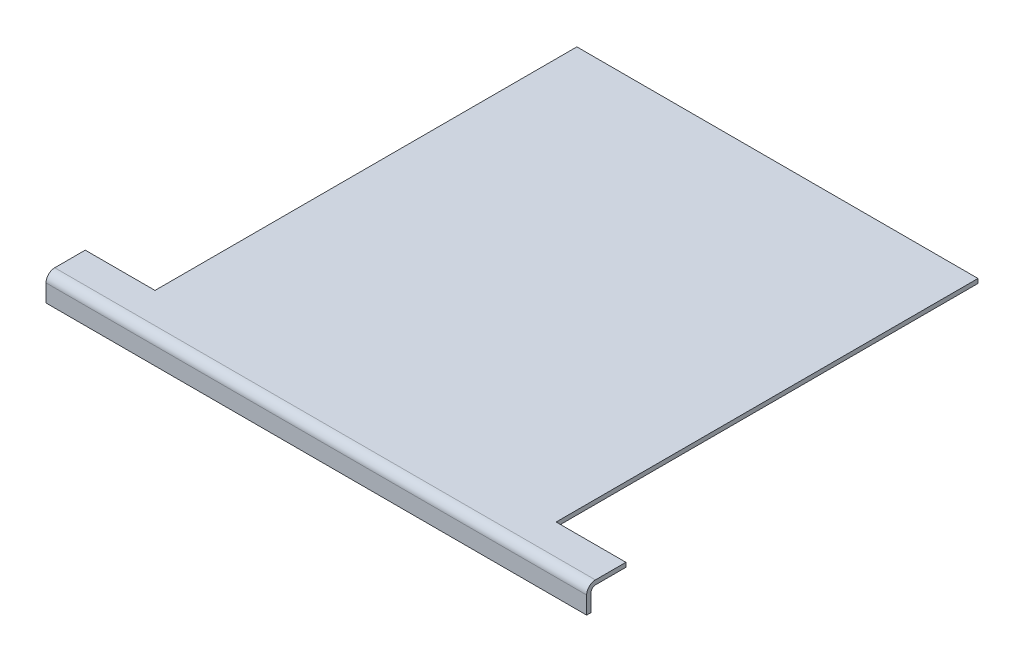
ISO-10303-21;
HEADER;
FILE_DESCRIPTION(('STEP AP214'),'2;1');
FILE_NAME('part.step','',(''),(''),'','','');
FILE_SCHEMA(('AUTOMOTIVE_DESIGN { 1 0 10303 214 1 1 1 1 }'));
ENDSEC;
DATA;
#1=APPLICATION_CONTEXT('core data for automotive mechanical design processes');
#2=APPLICATION_PROTOCOL_DEFINITION('international standard','automotive_design',2000,#1);
#3=PRODUCT_CONTEXT('',#1,'mechanical');
#4=PRODUCT('Part','Part','',(#3));
#5=PRODUCT_RELATED_PRODUCT_CATEGORY('part','',(#4));
#6=PRODUCT_DEFINITION_FORMATION('','',#4);
#7=PRODUCT_DEFINITION_CONTEXT('part definition',#1,'design');
#8=PRODUCT_DEFINITION('design','',#6,#7);
#9=PRODUCT_DEFINITION_SHAPE('','',#8);
#10=(LENGTH_UNIT() NAMED_UNIT(*) SI_UNIT(.MILLI.,.METRE.));
#11=(NAMED_UNIT(*) PLANE_ANGLE_UNIT() SI_UNIT($,.RADIAN.));
#12=(NAMED_UNIT(*) SI_UNIT($,.STERADIAN.) SOLID_ANGLE_UNIT());
#13=UNCERTAINTY_MEASURE_WITH_UNIT(LENGTH_MEASURE(1.E-05),#10,'distance_accuracy_value','');
#14=(GEOMETRIC_REPRESENTATION_CONTEXT(3) GLOBAL_UNCERTAINTY_ASSIGNED_CONTEXT((#13)) GLOBAL_UNIT_ASSIGNED_CONTEXT((#10,
#11,#12)) REPRESENTATION_CONTEXT('',''));
#15=CARTESIAN_POINT('',(0.,0.,0.));
#16=DIRECTION('',(0.,0.,1.));
#17=DIRECTION('',(1.,0.,0.));
#18=AXIS2_PLACEMENT_3D('',#15,#16,#17);
#19=CARTESIAN_POINT('',(-393.7,6.35,671.5252));
#20=DIRECTION('',(0.,0.,1.));
#21=DIRECTION('',(1.,0.,0.));
#22=AXIS2_PLACEMENT_3D('',#19,#20,#21);
#23=PLANE('',#22);
#24=DIRECTION('',(0.,1.,0.));
#25=VECTOR('',#24,1.);
#26=CARTESIAN_POINT('',(393.7,-19.05,671.5252));
#27=LINE('',#26,#25);
#28=CARTESIAN_POINT('',(393.7,-6.35,671.5252));
#29=VERTEX_POINT('',#28);
#30=CARTESIAN_POINT('',(393.7,-31.75,671.5252));
#31=VERTEX_POINT('',#30);
#32=EDGE_CURVE('E175',#29,#31,#27,.F.);
#33=ORIENTED_EDGE('',*,*,#32,.F.);
#34=DIRECTION('',(-1.,0.,0.));
#35=VECTOR('',#34,1.);
#36=CARTESIAN_POINT('',(393.7,-6.35,671.5252));
#37=LINE('',#36,#35);
#38=CARTESIAN_POINT('',(-393.7,-6.35,671.5252));
#39=VERTEX_POINT('',#38);
#40=EDGE_CURVE('E131',#39,#29,#37,.F.);
#41=ORIENTED_EDGE('',*,*,#40,.F.);
#42=DIRECTION('',(0.,1.,0.));
#43=VECTOR('',#42,1.);
#44=CARTESIAN_POINT('',(-393.7,-19.05,671.5252));
#45=LINE('',#44,#43);
#46=CARTESIAN_POINT('',(-393.7,-31.75,671.5252));
#47=VERTEX_POINT('',#46);
#48=EDGE_CURVE('E127',#47,#39,#45,.T.);
#49=ORIENTED_EDGE('',*,*,#48,.F.);
#50=DIRECTION('',(1.,0.,0.));
#51=VECTOR('',#50,1.);
#52=CARTESIAN_POINT('',(0.,-31.75,671.5252));
#53=LINE('',#52,#51);
#54=EDGE_CURVE('E194',#31,#47,#53,.F.);
#55=ORIENTED_EDGE('',*,*,#54,.F.);
#56=EDGE_LOOP('',(#33,#41,#49,#55));
#57=FACE_BOUND('',#56,.T.);
#58=ADVANCED_FACE('F33',(#57),#23,.T.);
#59=CARTESIAN_POINT('',(0.,-31.75,668.3502));
#60=DIRECTION('',(0.,-1.,0.));
#61=DIRECTION('',(0.,0.,-1.));
#62=AXIS2_PLACEMENT_3D('',#59,#60,#61);
#63=PLANE('',#62);
#64=DIRECTION('',(1.,0.,0.));
#65=VECTOR('',#64,1.);
#66=CARTESIAN_POINT('',(-393.7,-31.75,665.1752));
#67=LINE('',#66,#65);
#68=CARTESIAN_POINT('',(-393.7,-31.75,665.1752));
#69=VERTEX_POINT('',#68);
#70=CARTESIAN_POINT('',(393.7,-31.75,665.1752));
#71=VERTEX_POINT('',#70);
#72=EDGE_CURVE('E130',#69,#71,#67,.T.);
#73=ORIENTED_EDGE('',*,*,#72,.T.);
#74=DIRECTION('',(0.,0.,-1.));
#75=VECTOR('',#74,1.);
#76=CARTESIAN_POINT('',(393.7,-31.75,668.3502));
#77=LINE('',#76,#75);
#78=EDGE_CURVE('E177',#31,#71,#77,.T.);
#79=ORIENTED_EDGE('',*,*,#78,.F.);
#80=ORIENTED_EDGE('',*,*,#54,.T.);
#81=DIRECTION('',(0.,0.,1.));
#82=VECTOR('',#81,1.);
#83=CARTESIAN_POINT('',(-393.7,-31.75,668.3502));
#84=LINE('',#83,#82);
#85=EDGE_CURVE('E178',#69,#47,#84,.T.);
#86=ORIENTED_EDGE('',*,*,#85,.F.);
#87=EDGE_LOOP('',(#73,#79,#80,#86));
#88=FACE_BOUND('',#87,.T.);
#89=ADVANCED_FACE('F302',(#88),#63,.T.);
#90=CARTESIAN_POINT('',(393.7,-6.35,658.8252));
#91=DIRECTION('',(-1.,0.,0.));
#92=DIRECTION('',(0.,0.,1.));
#93=AXIS2_PLACEMENT_3D('',#90,#91,#92);
#94=CYLINDRICAL_SURFACE('',#93,12.7);
#95=DIRECTION('',(1.,0.,0.));
#96=VECTOR('',#95,1.);
#97=CARTESIAN_POINT('',(0.,6.35,658.8252));
#98=LINE('',#97,#96);
#99=CARTESIAN_POINT('',(-393.7,6.35,658.8252));
#100=VERTEX_POINT('',#99);
#101=CARTESIAN_POINT('',(393.7,6.35,658.8252));
#102=VERTEX_POINT('',#101);
#103=EDGE_CURVE('E133',#100,#102,#98,.T.);
#104=ORIENTED_EDGE('',*,*,#103,.F.);
#105=CARTESIAN_POINT('',(-393.7,-6.35,658.8252));
#106=DIRECTION('',(-1.,0.,0.));
#107=DIRECTION('',(0.,0.,1.));
#108=AXIS2_PLACEMENT_3D('',#105,#106,#107);
#109=CIRCLE('',#108,12.7);
#110=EDGE_CURVE('E36',#100,#39,#109,.F.);
#111=ORIENTED_EDGE('',*,*,#110,.T.);
#112=ORIENTED_EDGE('',*,*,#40,.T.);
#113=CARTESIAN_POINT('',(393.7,-6.35,658.8252));
#114=DIRECTION('',(-1.,0.,0.));
#115=DIRECTION('',(0.,0.,1.));
#116=AXIS2_PLACEMENT_3D('',#113,#114,#115);
#117=CIRCLE('',#116,12.7);
#118=EDGE_CURVE('E136',#102,#29,#117,.F.);
#119=ORIENTED_EDGE('',*,*,#118,.F.);
#120=EDGE_LOOP('',(#104,#111,#112,#119));
#121=FACE_BOUND('',#120,.T.);
#122=ADVANCED_FACE('F134',(#121),#94,.T.);
#123=CARTESIAN_POINT('',(-393.7,6.35,665.1752));
#124=DIRECTION('',(0.,0.,1.));
#125=DIRECTION('',(1.,0.,0.));
#126=AXIS2_PLACEMENT_3D('',#123,#124,#125);
#127=PLANE('',#126);
#128=DIRECTION('',(-1.,0.,0.));
#129=VECTOR('',#128,1.);
#130=CARTESIAN_POINT('',(393.7,-6.35,665.1752));
#131=LINE('',#130,#129);
#132=CARTESIAN_POINT('',(-393.7,-6.35,665.1752));
#133=VERTEX_POINT('',#132);
#134=CARTESIAN_POINT('',(393.7,-6.35,665.1752));
#135=VERTEX_POINT('',#134);
#136=EDGE_CURVE('E201',#133,#135,#131,.F.);
#137=ORIENTED_EDGE('',*,*,#136,.T.);
#138=DIRECTION('',(0.,1.,0.));
#139=VECTOR('',#138,1.);
#140=CARTESIAN_POINT('',(393.7,6.35,665.1752));
#141=LINE('',#140,#139);
#142=EDGE_CURVE('E187',#71,#135,#141,.T.);
#143=ORIENTED_EDGE('',*,*,#142,.F.);
#144=ORIENTED_EDGE('',*,*,#72,.F.);
#145=DIRECTION('',(0.,1.,0.));
#146=VECTOR('',#145,1.);
#147=CARTESIAN_POINT('',(-393.7,6.35,665.1752));
#148=LINE('',#147,#146);
#149=EDGE_CURVE('E202',#133,#69,#148,.F.);
#150=ORIENTED_EDGE('',*,*,#149,.F.);
#151=EDGE_LOOP('',(#137,#143,#144,#150));
#152=FACE_BOUND('',#151,.T.);
#153=ADVANCED_FACE('F297',(#152),#127,.F.);
#154=CARTESIAN_POINT('',(0.,6.35,0.));
#155=DIRECTION('',(0.,1.,0.));
#156=DIRECTION('',(0.,0.,1.));
#157=AXIS2_PLACEMENT_3D('',#154,#155,#156);
#158=PLANE('',#157);
#159=DIRECTION('',(0.,0.,1.));
#160=VECTOR('',#159,1.);
#161=CARTESIAN_POINT('',(292.1,6.35,307.1876));
#162=LINE('',#161,#160);
#163=CARTESIAN_POINT('',(292.1,6.35,614.3752));
#164=VERTEX_POINT('',#163);
#165=CARTESIAN_POINT('',(292.1,6.35,0.));
#166=VERTEX_POINT('',#165);
#167=EDGE_CURVE('E234',#164,#166,#162,.F.);
#168=ORIENTED_EDGE('',*,*,#167,.T.);
#169=DIRECTION('',(1.,0.,0.));
#170=VECTOR('',#169,1.);
#171=CARTESIAN_POINT('',(0.,6.35,0.));
#172=LINE('',#171,#170);
#173=CARTESIAN_POINT('',(-292.1,6.35,0.));
#174=VERTEX_POINT('',#173);
#175=EDGE_CURVE('E239',#166,#174,#172,.F.);
#176=ORIENTED_EDGE('',*,*,#175,.T.);
#177=DIRECTION('',(0.,0.,-1.));
#178=VECTOR('',#177,1.);
#179=CARTESIAN_POINT('',(-292.1,6.35,307.1876));
#180=LINE('',#179,#178);
#181=CARTESIAN_POINT('',(-292.1,6.35,614.3752));
#182=VERTEX_POINT('',#181);
#183=EDGE_CURVE('E169',#174,#182,#180,.F.);
#184=ORIENTED_EDGE('',*,*,#183,.T.);
#185=DIRECTION('',(1.,0.,0.));
#186=VECTOR('',#185,1.);
#187=CARTESIAN_POINT('',(-342.9,6.35,614.3752));
#188=LINE('',#187,#186);
#189=CARTESIAN_POINT('',(-393.7,6.35,614.3752));
#190=VERTEX_POINT('',#189);
#191=EDGE_CURVE('E139',#182,#190,#188,.F.);
#192=ORIENTED_EDGE('',*,*,#191,.T.);
#193=DIRECTION('',(0.,0.,-1.));
#194=VECTOR('',#193,1.);
#195=CARTESIAN_POINT('',(-393.7,6.35,642.9502));
#196=LINE('',#195,#194);
#197=EDGE_CURVE('E123',#190,#100,#196,.F.);
#198=ORIENTED_EDGE('',*,*,#197,.T.);
#199=ORIENTED_EDGE('',*,*,#103,.T.);
#200=DIRECTION('',(0.,0.,1.));
#201=VECTOR('',#200,1.);
#202=CARTESIAN_POINT('',(393.7,6.35,642.9502));
#203=LINE('',#202,#201);
#204=CARTESIAN_POINT('',(393.7,6.35,614.3752));
#205=VERTEX_POINT('',#204);
#206=EDGE_CURVE('E213',#102,#205,#203,.F.);
#207=ORIENTED_EDGE('',*,*,#206,.T.);
#208=DIRECTION('',(1.,0.,0.));
#209=VECTOR('',#208,1.);
#210=CARTESIAN_POINT('',(342.9,6.35,614.3752));
#211=LINE('',#210,#209);
#212=EDGE_CURVE('E229',#205,#164,#211,.F.);
#213=ORIENTED_EDGE('',*,*,#212,.T.);
#214=EDGE_LOOP('',(#168,#176,#184,#192,#198,#199,#207,#213));
#215=FACE_BOUND('',#214,.T.);
#216=ADVANCED_FACE('F141',(#215),#158,.T.);
#217=CARTESIAN_POINT('',(-342.9,3.175,614.3752));
#218=DIRECTION('',(0.,0.,1.));
#219=DIRECTION('',(1.,0.,0.));
#220=AXIS2_PLACEMENT_3D('',#217,#218,#219);
#221=PLANE('',#220);
#222=DIRECTION('',(0.,1.,0.));
#223=VECTOR('',#222,1.);
#224=CARTESIAN_POINT('',(-393.7,3.175,614.3752));
#225=LINE('',#224,#223);
#226=CARTESIAN_POINT('',(-393.7,0.,614.3752));
#227=VERTEX_POINT('',#226);
#228=EDGE_CURVE('E144',#227,#190,#225,.T.);
#229=ORIENTED_EDGE('',*,*,#228,.T.);
#230=ORIENTED_EDGE('',*,*,#191,.F.);
#231=DIRECTION('',(0.,1.,0.));
#232=VECTOR('',#231,1.);
#233=CARTESIAN_POINT('',(-292.1,3.175,614.3752));
#234=LINE('',#233,#232);
#235=CARTESIAN_POINT('',(-292.1,0.,614.3752));
#236=VERTEX_POINT('',#235);
#237=EDGE_CURVE('E164',#182,#236,#234,.F.);
#238=ORIENTED_EDGE('',*,*,#237,.T.);
#239=DIRECTION('',(1.,0.,0.));
#240=VECTOR('',#239,1.);
#241=CARTESIAN_POINT('',(0.,0.,614.3752));
#242=LINE('',#241,#240);
#243=EDGE_CURVE('E160',#236,#227,#242,.F.);
#244=ORIENTED_EDGE('',*,*,#243,.T.);
#245=EDGE_LOOP('',(#229,#230,#238,#244));
#246=FACE_BOUND('',#245,.T.);
#247=ADVANCED_FACE('F271',(#246),#221,.F.);
#248=CARTESIAN_POINT('',(-393.7,3.175,642.9502));
#249=DIRECTION('',(1.,0.,0.));
#250=DIRECTION('',(0.,0.,-1.));
#251=AXIS2_PLACEMENT_3D('',#248,#249,#250);
#252=PLANE('',#251);
#253=ORIENTED_EDGE('',*,*,#110,.F.);
#254=ORIENTED_EDGE('',*,*,#197,.F.);
#255=ORIENTED_EDGE('',*,*,#228,.F.);
#256=DIRECTION('',(0.,0.,1.));
#257=VECTOR('',#256,1.);
#258=CARTESIAN_POINT('',(-393.7,0.,0.));
#259=LINE('',#258,#257);
#260=CARTESIAN_POINT('',(-393.7,0.,658.8252));
#261=VERTEX_POINT('',#260);
#262=EDGE_CURVE('E163',#227,#261,#259,.T.);
#263=ORIENTED_EDGE('',*,*,#262,.T.);
#264=CARTESIAN_POINT('',(-393.7,-6.35,658.8252));
#265=DIRECTION('',(-1.,0.,0.));
#266=DIRECTION('',(0.,0.,1.));
#267=AXIS2_PLACEMENT_3D('',#264,#265,#266);
#268=CIRCLE('',#267,6.35);
#269=EDGE_CURVE('E146',#261,#133,#268,.F.);
#270=ORIENTED_EDGE('',*,*,#269,.T.);
#271=ORIENTED_EDGE('',*,*,#149,.T.);
#272=ORIENTED_EDGE('',*,*,#85,.T.);
#273=ORIENTED_EDGE('',*,*,#48,.T.);
#274=EDGE_LOOP('',(#253,#254,#255,#263,#270,#271,#272,#273));
#275=FACE_BOUND('',#274,.T.);
#276=ADVANCED_FACE('F121',(#275),#252,.F.);
#277=CARTESIAN_POINT('',(393.7,-6.35,658.8252));
#278=DIRECTION('',(-1.,0.,0.));
#279=DIRECTION('',(0.,0.,1.));
#280=AXIS2_PLACEMENT_3D('',#277,#278,#279);
#281=CYLINDRICAL_SURFACE('',#280,6.35);
#282=ORIENTED_EDGE('',*,*,#269,.F.);
#283=DIRECTION('',(1.,0.,0.));
#284=VECTOR('',#283,1.);
#285=CARTESIAN_POINT('',(0.,0.,658.8252));
#286=LINE('',#285,#284);
#287=CARTESIAN_POINT('',(393.7,0.,658.8252));
#288=VERTEX_POINT('',#287);
#289=EDGE_CURVE('E217',#261,#288,#286,.T.);
#290=ORIENTED_EDGE('',*,*,#289,.T.);
#291=CARTESIAN_POINT('',(393.7,-6.35,658.8252));
#292=DIRECTION('',(-1.,0.,0.));
#293=DIRECTION('',(0.,0.,1.));
#294=AXIS2_PLACEMENT_3D('',#291,#292,#293);
#295=CIRCLE('',#294,6.35);
#296=EDGE_CURVE('E143',#135,#288,#295,.T.);
#297=ORIENTED_EDGE('',*,*,#296,.F.);
#298=ORIENTED_EDGE('',*,*,#136,.F.);
#299=EDGE_LOOP('',(#282,#290,#297,#298));
#300=FACE_BOUND('',#299,.T.);
#301=ADVANCED_FACE('F268',(#300),#281,.F.);
#302=CARTESIAN_POINT('',(393.7,3.175,642.9502));
#303=DIRECTION('',(-1.,0.,0.));
#304=DIRECTION('',(0.,0.,1.));
#305=AXIS2_PLACEMENT_3D('',#302,#303,#304);
#306=PLANE('',#305);
#307=ORIENTED_EDGE('',*,*,#296,.T.);
#308=DIRECTION('',(0.,0.,1.));
#309=VECTOR('',#308,1.);
#310=CARTESIAN_POINT('',(393.7,0.,0.));
#311=LINE('',#310,#309);
#312=CARTESIAN_POINT('',(393.7,0.,614.3752));
#313=VERTEX_POINT('',#312);
#314=EDGE_CURVE('E223',#288,#313,#311,.F.);
#315=ORIENTED_EDGE('',*,*,#314,.T.);
#316=DIRECTION('',(0.,1.,0.));
#317=VECTOR('',#316,1.);
#318=CARTESIAN_POINT('',(393.7,3.175,614.3752));
#319=LINE('',#318,#317);
#320=EDGE_CURVE('E220',#313,#205,#319,.T.);
#321=ORIENTED_EDGE('',*,*,#320,.T.);
#322=ORIENTED_EDGE('',*,*,#206,.F.);
#323=ORIENTED_EDGE('',*,*,#118,.T.);
#324=ORIENTED_EDGE('',*,*,#32,.T.);
#325=ORIENTED_EDGE('',*,*,#78,.T.);
#326=ORIENTED_EDGE('',*,*,#142,.T.);
#327=EDGE_LOOP('',(#307,#315,#321,#322,#323,#324,#325,#326));
#328=FACE_BOUND('',#327,.T.);
#329=ADVANCED_FACE('F264',(#328),#306,.F.);
#330=CARTESIAN_POINT('',(342.9,3.175,614.3752));
#331=DIRECTION('',(0.,0.,1.));
#332=DIRECTION('',(1.,0.,0.));
#333=AXIS2_PLACEMENT_3D('',#330,#331,#332);
#334=PLANE('',#333);
#335=DIRECTION('',(0.,1.,0.));
#336=VECTOR('',#335,1.);
#337=CARTESIAN_POINT('',(292.1,3.175,614.3752));
#338=LINE('',#337,#336);
#339=CARTESIAN_POINT('',(292.1,0.,614.3752));
#340=VERTEX_POINT('',#339);
#341=EDGE_CURVE('E231',#340,#164,#338,.T.);
#342=ORIENTED_EDGE('',*,*,#341,.T.);
#343=ORIENTED_EDGE('',*,*,#212,.F.);
#344=ORIENTED_EDGE('',*,*,#320,.F.);
#345=DIRECTION('',(1.,0.,0.));
#346=VECTOR('',#345,1.);
#347=CARTESIAN_POINT('',(0.,0.,614.3752));
#348=LINE('',#347,#346);
#349=EDGE_CURVE('E226',#313,#340,#348,.F.);
#350=ORIENTED_EDGE('',*,*,#349,.T.);
#351=EDGE_LOOP('',(#342,#343,#344,#350));
#352=FACE_BOUND('',#351,.T.);
#353=ADVANCED_FACE('F261',(#352),#334,.F.);
#354=CARTESIAN_POINT('',(292.1,3.175,307.1876));
#355=DIRECTION('',(-1.,0.,0.));
#356=DIRECTION('',(0.,0.,1.));
#357=AXIS2_PLACEMENT_3D('',#354,#355,#356);
#358=PLANE('',#357);
#359=DIRECTION('',(0.,1.,0.));
#360=VECTOR('',#359,1.);
#361=CARTESIAN_POINT('',(292.1,3.175,0.));
#362=LINE('',#361,#360);
#363=CARTESIAN_POINT('',(292.1,0.,0.));
#364=VERTEX_POINT('',#363);
#365=EDGE_CURVE('E236',#364,#166,#362,.T.);
#366=ORIENTED_EDGE('',*,*,#365,.T.);
#367=ORIENTED_EDGE('',*,*,#167,.F.);
#368=ORIENTED_EDGE('',*,*,#341,.F.);
#369=DIRECTION('',(0.,0.,1.));
#370=VECTOR('',#369,1.);
#371=CARTESIAN_POINT('',(292.1,0.,0.));
#372=LINE('',#371,#370);
#373=EDGE_CURVE('E244',#340,#364,#372,.F.);
#374=ORIENTED_EDGE('',*,*,#373,.T.);
#375=EDGE_LOOP('',(#366,#367,#368,#374));
#376=FACE_BOUND('',#375,.T.);
#377=ADVANCED_FACE('F257',(#376),#358,.F.);
#378=CARTESIAN_POINT('',(0.,3.175,0.));
#379=DIRECTION('',(0.,0.,1.));
#380=DIRECTION('',(1.,0.,0.));
#381=AXIS2_PLACEMENT_3D('',#378,#379,#380);
#382=PLANE('',#381);
#383=DIRECTION('',(0.,1.,0.));
#384=VECTOR('',#383,1.);
#385=CARTESIAN_POINT('',(-292.1,3.175,0.));
#386=LINE('',#385,#384);
#387=CARTESIAN_POINT('',(-292.1,0.,0.));
#388=VERTEX_POINT('',#387);
#389=EDGE_CURVE('E50',#388,#174,#386,.T.);
#390=ORIENTED_EDGE('',*,*,#389,.T.);
#391=ORIENTED_EDGE('',*,*,#175,.F.);
#392=ORIENTED_EDGE('',*,*,#365,.F.);
#393=DIRECTION('',(1.,0.,0.));
#394=VECTOR('',#393,1.);
#395=CARTESIAN_POINT('',(0.,0.,0.));
#396=LINE('',#395,#394);
#397=EDGE_CURVE('E42',#364,#388,#396,.F.);
#398=ORIENTED_EDGE('',*,*,#397,.T.);
#399=EDGE_LOOP('',(#390,#391,#392,#398));
#400=FACE_BOUND('',#399,.T.);
#401=ADVANCED_FACE('F250',(#400),#382,.F.);
#402=CARTESIAN_POINT('',(-292.1,3.175,307.1876));
#403=DIRECTION('',(1.,0.,0.));
#404=DIRECTION('',(0.,0.,-1.));
#405=AXIS2_PLACEMENT_3D('',#402,#403,#404);
#406=PLANE('',#405);
#407=ORIENTED_EDGE('',*,*,#237,.F.);
#408=ORIENTED_EDGE('',*,*,#183,.F.);
#409=ORIENTED_EDGE('',*,*,#389,.F.);
#410=DIRECTION('',(0.,0.,1.));
#411=VECTOR('',#410,1.);
#412=CARTESIAN_POINT('',(-292.1,0.,0.));
#413=LINE('',#412,#411);
#414=EDGE_CURVE('E11',#388,#236,#413,.T.);
#415=ORIENTED_EDGE('',*,*,#414,.T.);
#416=EDGE_LOOP('',(#407,#408,#409,#415));
#417=FACE_BOUND('',#416,.T.);
#418=ADVANCED_FACE('F273',(#417),#406,.F.);
#419=CARTESIAN_POINT('',(0.,0.,0.));
#420=DIRECTION('',(0.,1.,0.));
#421=DIRECTION('',(0.,0.,1.));
#422=AXIS2_PLACEMENT_3D('',#419,#420,#421);
#423=PLANE('',#422);
#424=ORIENTED_EDGE('',*,*,#397,.F.);
#425=ORIENTED_EDGE('',*,*,#373,.F.);
#426=ORIENTED_EDGE('',*,*,#349,.F.);
#427=ORIENTED_EDGE('',*,*,#314,.F.);
#428=ORIENTED_EDGE('',*,*,#289,.F.);
#429=ORIENTED_EDGE('',*,*,#262,.F.);
#430=ORIENTED_EDGE('',*,*,#243,.F.);
#431=ORIENTED_EDGE('',*,*,#414,.F.);
#432=EDGE_LOOP('',(#424,#425,#426,#427,#428,#429,#430,#431));
#433=FACE_BOUND('',#432,.T.);
#434=ADVANCED_FACE('F254',(#433),#423,.F.);
#435=CLOSED_SHELL('',(#58,#89,#122,#153,#216,#247,#276,#301,#329,#353,#377,#401,#418,#434));
#436=MANIFOLD_SOLID_BREP('B2',#435);
#437=ADVANCED_BREP_SHAPE_REPRESENTATION('',(#18,#436),#14);
#438=SHAPE_DEFINITION_REPRESENTATION(#9,#437);
ENDSEC;
END-ISO-10303-21;
